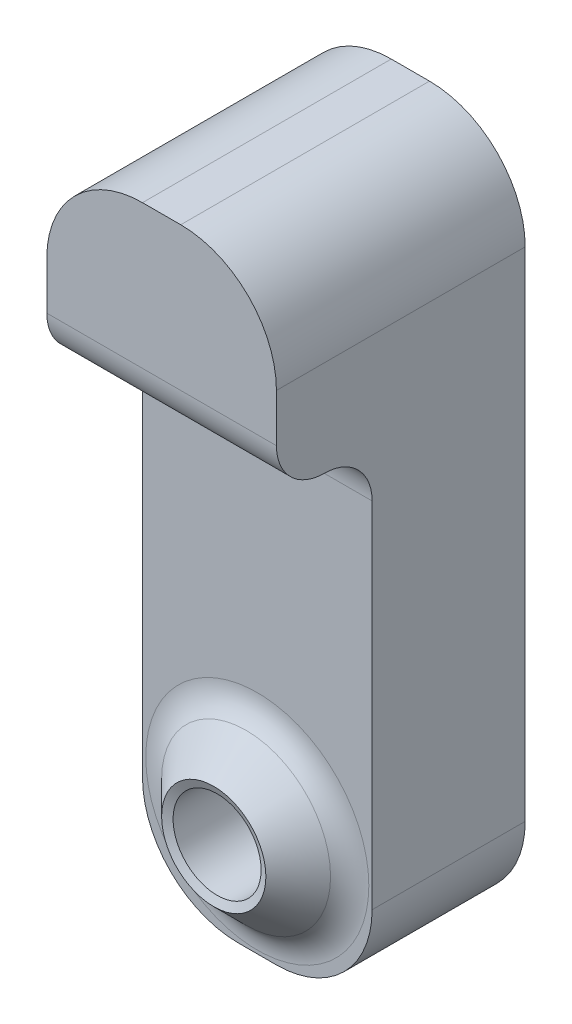
ISO-10303-21;
HEADER;
FILE_DESCRIPTION(('STEP AP214'),'2;1');
FILE_NAME('part.step','',(''),(''),'','','');
FILE_SCHEMA(('AUTOMOTIVE_DESIGN { 1 0 10303 214 1 1 1 1 }'));
ENDSEC;
DATA;
#1=APPLICATION_CONTEXT('core data for automotive mechanical design processes');
#2=APPLICATION_PROTOCOL_DEFINITION('international standard','automotive_design',2000,#1);
#3=PRODUCT_CONTEXT('',#1,'mechanical');
#4=PRODUCT('Part','Part','',(#3));
#5=PRODUCT_RELATED_PRODUCT_CATEGORY('part','',(#4));
#6=PRODUCT_DEFINITION_FORMATION('','',#4);
#7=PRODUCT_DEFINITION_CONTEXT('part definition',#1,'design');
#8=PRODUCT_DEFINITION('design','',#6,#7);
#9=PRODUCT_DEFINITION_SHAPE('','',#8);
#10=(LENGTH_UNIT() NAMED_UNIT(*) SI_UNIT(.MILLI.,.METRE.));
#11=(NAMED_UNIT(*) PLANE_ANGLE_UNIT() SI_UNIT($,.RADIAN.));
#12=(NAMED_UNIT(*) SI_UNIT($,.STERADIAN.) SOLID_ANGLE_UNIT());
#13=UNCERTAINTY_MEASURE_WITH_UNIT(LENGTH_MEASURE(1.E-05),#10,'distance_accuracy_value','');
#14=(GEOMETRIC_REPRESENTATION_CONTEXT(3) GLOBAL_UNCERTAINTY_ASSIGNED_CONTEXT((#13)) GLOBAL_UNIT_ASSIGNED_CONTEXT((#10,
#11,#12)) REPRESENTATION_CONTEXT('',''));
#15=CARTESIAN_POINT('',(0.,0.,0.));
#16=DIRECTION('',(0.,0.,1.));
#17=DIRECTION('',(1.,0.,0.));
#18=AXIS2_PLACEMENT_3D('',#15,#16,#17);
#19=CARTESIAN_POINT('',(0.,0.,8.));
#20=DIRECTION('',(0.,0.,1.));
#21=DIRECTION('',(1.,0.,0.));
#22=AXIS2_PLACEMENT_3D('',#19,#20,#21);
#23=PLANE('',#22);
#24=CARTESIAN_POINT('',(0.,-12.,8.));
#25=DIRECTION('',(0.,0.,1.));
#26=DIRECTION('',(1.,0.,0.));
#27=AXIS2_PLACEMENT_3D('',#24,#25,#26);
#28=CIRCLE('',#27,5.82842712474619);
#29=CARTESIAN_POINT('',(5.8284271247462,-12.,8.));
#30=VERTEX_POINT('',#29);
#31=EDGE_CURVE('E452',#30,#30,#28,.F.);
#32=ORIENTED_EDGE('',*,*,#31,.T.);
#33=EDGE_LOOP('',(#32));
#34=FACE_BOUND('',#33,.T.);
#35=DIRECTION('',(0.,1.,0.));
#36=VECTOR('',#35,1.);
#37=CARTESIAN_POINT('',(-6.,5.5,8.));
#38=LINE('',#37,#36);
#39=CARTESIAN_POINT('',(-6.,-13.,8.));
#40=VERTEX_POINT('',#39);
#41=CARTESIAN_POINT('',(-6.,5.5,8.));
#42=VERTEX_POINT('',#41);
#43=EDGE_CURVE('E138',#40,#42,#38,.T.);
#44=ORIENTED_EDGE('',*,*,#43,.F.);
#45=CARTESIAN_POINT('',(-1.,-13.,8.));
#46=DIRECTION('',(0.,0.,1.));
#47=DIRECTION('',(1.,0.,0.));
#48=AXIS2_PLACEMENT_3D('',#45,#46,#47);
#49=CIRCLE('',#48,5.);
#50=CARTESIAN_POINT('',(-1.,-18.,8.));
#51=VERTEX_POINT('',#50);
#52=EDGE_CURVE('E464',#40,#51,#49,.T.);
#53=ORIENTED_EDGE('',*,*,#52,.T.);
#54=DIRECTION('',(-1.,0.,0.));
#55=VECTOR('',#54,1.);
#56=CARTESIAN_POINT('',(-5.,-18.,8.));
#57=LINE('',#56,#55);
#58=CARTESIAN_POINT('',(0.999999999999998,-18.,8.));
#59=VERTEX_POINT('',#58);
#60=EDGE_CURVE('E175',#59,#51,#57,.T.);
#61=ORIENTED_EDGE('',*,*,#60,.F.);
#62=CARTESIAN_POINT('',(0.999999999999998,-13.,8.));
#63=DIRECTION('',(0.,0.,1.));
#64=DIRECTION('',(1.,0.,0.));
#65=AXIS2_PLACEMENT_3D('',#62,#63,#64);
#66=CIRCLE('',#65,5.);
#67=CARTESIAN_POINT('',(6.,-13.,8.));
#68=VERTEX_POINT('',#67);
#69=EDGE_CURVE('E462',#59,#68,#66,.T.);
#70=ORIENTED_EDGE('',*,*,#69,.T.);
#71=DIRECTION('',(0.,-1.,0.));
#72=VECTOR('',#71,1.);
#73=CARTESIAN_POINT('',(6.,-17.,8.));
#74=LINE('',#73,#72);
#75=CARTESIAN_POINT('',(6.,5.5,8.));
#76=VERTEX_POINT('',#75);
#77=EDGE_CURVE('E154',#76,#68,#74,.T.);
#78=ORIENTED_EDGE('',*,*,#77,.F.);
#79=DIRECTION('',(1.,0.,0.));
#80=VECTOR('',#79,1.);
#81=CARTESIAN_POINT('',(0.,5.5,8.));
#82=LINE('',#81,#80);
#83=EDGE_CURVE('E152',#76,#42,#82,.F.);
#84=ORIENTED_EDGE('',*,*,#83,.T.);
#85=EDGE_LOOP('',(#44,#53,#61,#70,#78,#84));
#86=FACE_BOUND('',#85,.T.);
#87=ADVANCED_FACE('F54',(#34,#86),#23,.T.);
#88=CARTESIAN_POINT('',(0.,0.,0.));
#89=DIRECTION('',(0.,0.,1.));
#90=DIRECTION('',(1.,0.,0.));
#91=AXIS2_PLACEMENT_3D('',#88,#89,#90);
#92=PLANE('',#91);
#93=CARTESIAN_POINT('',(0.,-12.,0.));
#94=DIRECTION('',(0.,0.,-1.));
#95=DIRECTION('',(1.,0.,0.));
#96=AXIS2_PLACEMENT_3D('',#93,#94,#95);
#97=CIRCLE('',#96,4.125);
#98=CARTESIAN_POINT('',(4.125,-12.,0.));
#99=VERTEX_POINT('',#98);
#100=EDGE_CURVE('E196',#99,#99,#97,.T.);
#101=ORIENTED_EDGE('',*,*,#100,.F.);
#102=EDGE_LOOP('',(#101));
#103=FACE_BOUND('',#102,.T.);
#104=DIRECTION('',(1.,0.,0.));
#105=VECTOR('',#104,1.);
#106=CARTESIAN_POINT('',(6.,-18.,0.));
#107=LINE('',#106,#105);
#108=CARTESIAN_POINT('',(-1.,-18.,0.));
#109=VERTEX_POINT('',#108);
#110=CARTESIAN_POINT('',(0.999999999999998,-18.,0.));
#111=VERTEX_POINT('',#110);
#112=EDGE_CURVE('E172',#109,#111,#107,.T.);
#113=ORIENTED_EDGE('',*,*,#112,.F.);
#114=CARTESIAN_POINT('',(-1.,-13.,0.));
#115=DIRECTION('',(0.,0.,1.));
#116=DIRECTION('',(1.,0.,0.));
#117=AXIS2_PLACEMENT_3D('',#114,#115,#116);
#118=CIRCLE('',#117,5.);
#119=CARTESIAN_POINT('',(-6.,-13.,0.));
#120=VERTEX_POINT('',#119);
#121=EDGE_CURVE('E477',#109,#120,#118,.F.);
#122=ORIENTED_EDGE('',*,*,#121,.T.);
#123=DIRECTION('',(0.,-1.,0.));
#124=VECTOR('',#123,1.);
#125=CARTESIAN_POINT('',(-6.,-18.,0.));
#126=LINE('',#125,#124);
#127=CARTESIAN_POINT('',(-6.,13.,0.));
#128=VERTEX_POINT('',#127);
#129=EDGE_CURVE('E149',#128,#120,#126,.T.);
#130=ORIENTED_EDGE('',*,*,#129,.F.);
#131=CARTESIAN_POINT('',(-1.,13.,0.));
#132=DIRECTION('',(0.,0.,1.));
#133=DIRECTION('',(1.,0.,0.));
#134=AXIS2_PLACEMENT_3D('',#131,#132,#133);
#135=CIRCLE('',#134,5.);
#136=CARTESIAN_POINT('',(-1.,18.,0.));
#137=VERTEX_POINT('',#136);
#138=EDGE_CURVE('E473',#128,#137,#135,.F.);
#139=ORIENTED_EDGE('',*,*,#138,.T.);
#140=DIRECTION('',(-1.,0.,0.));
#141=VECTOR('',#140,1.);
#142=CARTESIAN_POINT('',(-4.99999999999999,18.,0.));
#143=LINE('',#142,#141);
#144=CARTESIAN_POINT('',(1.,18.,0.));
#145=VERTEX_POINT('',#144);
#146=EDGE_CURVE('E180',#145,#137,#143,.T.);
#147=ORIENTED_EDGE('',*,*,#146,.F.);
#148=CARTESIAN_POINT('',(1.,13.,0.));
#149=DIRECTION('',(0.,0.,1.));
#150=DIRECTION('',(1.,0.,0.));
#151=AXIS2_PLACEMENT_3D('',#148,#149,#150);
#152=CIRCLE('',#151,5.);
#153=CARTESIAN_POINT('',(6.,13.,0.));
#154=VERTEX_POINT('',#153);
#155=EDGE_CURVE('E471',#145,#154,#152,.F.);
#156=ORIENTED_EDGE('',*,*,#155,.T.);
#157=DIRECTION('',(0.,1.,0.));
#158=VECTOR('',#157,1.);
#159=CARTESIAN_POINT('',(6.,10.5,0.));
#160=LINE('',#159,#158);
#161=CARTESIAN_POINT('',(6.,-13.,0.));
#162=VERTEX_POINT('',#161);
#163=EDGE_CURVE('E190',#162,#154,#160,.T.);
#164=ORIENTED_EDGE('',*,*,#163,.F.);
#165=CARTESIAN_POINT('',(0.999999999999998,-13.,0.));
#166=DIRECTION('',(0.,0.,1.));
#167=DIRECTION('',(1.,0.,0.));
#168=AXIS2_PLACEMENT_3D('',#165,#166,#167);
#169=CIRCLE('',#168,5.);
#170=EDGE_CURVE('E475',#162,#111,#169,.F.);
#171=ORIENTED_EDGE('',*,*,#170,.T.);
#172=EDGE_LOOP('',(#113,#122,#130,#139,#147,#156,#164,#171));
#173=FACE_BOUND('',#172,.T.);
#174=ADVANCED_FACE('F492',(#103,#173),#92,.F.);
#175=CARTESIAN_POINT('',(0.,10.5,10.5));
#176=DIRECTION('',(-1.,0.,0.));
#177=DIRECTION('',(0.,0.,1.));
#178=AXIS2_PLACEMENT_3D('',#175,#176,#177);
#179=CYLINDRICAL_SURFACE('',#178,2.5);
#180=DIRECTION('',(1.,0.,0.));
#181=VECTOR('',#180,1.);
#182=CARTESIAN_POINT('',(-6.,8.,10.5));
#183=LINE('',#182,#181);
#184=CARTESIAN_POINT('',(6.,8.,10.5));
#185=VERTEX_POINT('',#184);
#186=CARTESIAN_POINT('',(-6.,8.,10.5));
#187=VERTEX_POINT('',#186);
#188=EDGE_CURVE('E163',#185,#187,#183,.F.);
#189=ORIENTED_EDGE('',*,*,#188,.F.);
#190=CARTESIAN_POINT('',(6.,10.5,10.5));
#191=DIRECTION('',(1.,0.,0.));
#192=DIRECTION('',(0.,-1.,0.));
#193=AXIS2_PLACEMENT_3D('',#190,#191,#192);
#194=CIRCLE('',#193,2.5);
#195=CARTESIAN_POINT('',(6.,10.5,13.));
#196=VERTEX_POINT('',#195);
#197=EDGE_CURVE('E184',#196,#185,#194,.T.);
#198=ORIENTED_EDGE('',*,*,#197,.F.);
#199=DIRECTION('',(1.,0.,0.));
#200=VECTOR('',#199,1.);
#201=CARTESIAN_POINT('',(6.,10.5,13.));
#202=LINE('',#201,#200);
#203=CARTESIAN_POINT('',(-6.,10.5,13.));
#204=VERTEX_POINT('',#203);
#205=EDGE_CURVE('E160',#204,#196,#202,.T.);
#206=ORIENTED_EDGE('',*,*,#205,.F.);
#207=CARTESIAN_POINT('',(-6.,10.5,10.5));
#208=DIRECTION('',(-1.,0.,0.));
#209=DIRECTION('',(0.,1.,0.));
#210=AXIS2_PLACEMENT_3D('',#207,#208,#209);
#211=CIRCLE('',#210,2.5);
#212=EDGE_CURVE('E164',#187,#204,#211,.T.);
#213=ORIENTED_EDGE('',*,*,#212,.F.);
#214=EDGE_LOOP('',(#189,#198,#206,#213));
#215=FACE_BOUND('',#214,.T.);
#216=ADVANCED_FACE('F503',(#215),#179,.T.);
#217=CARTESIAN_POINT('',(0.,5.5,10.5));
#218=DIRECTION('',(1.,0.,0.));
#219=DIRECTION('',(0.,0.,-1.));
#220=AXIS2_PLACEMENT_3D('',#217,#218,#219);
#221=CYLINDRICAL_SURFACE('',#220,2.5);
#222=ORIENTED_EDGE('',*,*,#83,.F.);
#223=CARTESIAN_POINT('',(6.,5.5,10.5));
#224=DIRECTION('',(-1.,0.,0.));
#225=DIRECTION('',(0.,1.,0.));
#226=AXIS2_PLACEMENT_3D('',#223,#224,#225);
#227=CIRCLE('',#226,2.5);
#228=EDGE_CURVE('E187',#185,#76,#227,.T.);
#229=ORIENTED_EDGE('',*,*,#228,.F.);
#230=ORIENTED_EDGE('',*,*,#188,.T.);
#231=CARTESIAN_POINT('',(-6.,5.5,10.5));
#232=DIRECTION('',(1.,0.,0.));
#233=DIRECTION('',(0.,-1.,0.));
#234=AXIS2_PLACEMENT_3D('',#231,#232,#233);
#235=CIRCLE('',#234,2.5);
#236=EDGE_CURVE('E144',#42,#187,#235,.T.);
#237=ORIENTED_EDGE('',*,*,#236,.F.);
#238=EDGE_LOOP('',(#222,#229,#230,#237));
#239=FACE_BOUND('',#238,.T.);
#240=ADVANCED_FACE('F162',(#239),#221,.F.);
#241=CARTESIAN_POINT('',(0.,-12.,39.4724285712124));
#242=DIRECTION('',(0.,0.,-1.));
#243=DIRECTION('',(-1.,0.,0.));
#244=AXIS2_PLACEMENT_3D('',#241,#242,#243);
#245=CYLINDRICAL_SURFACE('',#244,2.3);
#246=CARTESIAN_POINT('',(0.,-12.,10.1));
#247=DIRECTION('',(0.,0.,1.));
#248=DIRECTION('',(1.,0.,0.));
#249=AXIS2_PLACEMENT_3D('',#246,#247,#248);
#250=CIRCLE('',#249,2.3);
#251=CARTESIAN_POINT('',(2.3,-12.,10.1));
#252=VERTEX_POINT('',#251);
#253=EDGE_CURVE('E449',#252,#252,#250,.T.);
#254=ORIENTED_EDGE('',*,*,#253,.T.);
#255=EDGE_LOOP('',(#254));
#256=FACE_BOUND('',#255,.T.);
#257=CARTESIAN_POINT('',(0.,-12.,4.));
#258=DIRECTION('',(0.,0.,-1.));
#259=DIRECTION('',(1.,0.,0.));
#260=AXIS2_PLACEMENT_3D('',#257,#258,#259);
#261=CIRCLE('',#260,2.3);
#262=CARTESIAN_POINT('',(2.3,-12.,4.));
#263=VERTEX_POINT('',#262);
#264=EDGE_CURVE('E193',#263,#263,#261,.T.);
#265=ORIENTED_EDGE('',*,*,#264,.T.);
#266=EDGE_LOOP('',(#265));
#267=FACE_BOUND('',#266,.T.);
#268=ADVANCED_FACE('F574',(#256,#267),#245,.F.);
#269=CARTESIAN_POINT('',(0.,-12.,12.));
#270=DIRECTION('',(0.,0.,-1.));
#271=DIRECTION('',(-1.,0.,0.));
#272=AXIS2_PLACEMENT_3D('',#269,#270,#271);
#273=CONICAL_SURFACE('',#272,1.,0.785398163397448);
#274=CARTESIAN_POINT('',(0.,-12.,8.5857864376269));
#275=DIRECTION('',(0.,0.,-1.));
#276=DIRECTION('',(-1.,0.,0.));
#277=AXIS2_PLACEMENT_3D('',#274,#275,#276);
#278=CIRCLE('',#277,4.4142135623731);
#279=CARTESIAN_POINT('',(-4.41421356237309,-12.,8.5857864376269));
#280=VERTEX_POINT('',#279);
#281=EDGE_CURVE('E455',#280,#280,#278,.F.);
#282=ORIENTED_EDGE('',*,*,#281,.T.);
#283=EDGE_LOOP('',(#282));
#284=FACE_BOUND('',#283,.T.);
#285=CARTESIAN_POINT('',(0.,-12.,10.2757359312881));
#286=DIRECTION('',(0.,0.,1.));
#287=DIRECTION('',(1.,0.,0.));
#288=AXIS2_PLACEMENT_3D('',#285,#286,#287);
#289=CIRCLE('',#288,2.72426406871192);
#290=CARTESIAN_POINT('',(2.72426406871192,-12.,10.2757359312881));
#291=VERTEX_POINT('',#290);
#292=EDGE_CURVE('E159',#291,#291,#289,.F.);
#293=ORIENTED_EDGE('',*,*,#292,.T.);
#294=EDGE_LOOP('',(#293));
#295=FACE_BOUND('',#294,.T.);
#296=ADVANCED_FACE('F570',(#284,#295),#273,.T.);
#297=CARTESIAN_POINT('',(0.,-12.,4.));
#298=DIRECTION('',(0.,0.,-1.));
#299=DIRECTION('',(-1.,0.,0.));
#300=AXIS2_PLACEMENT_3D('',#297,#298,#299);
#301=CYLINDRICAL_SURFACE('',#300,4.125);
#302=CARTESIAN_POINT('',(0.,-12.,4.));
#303=DIRECTION('',(0.,0.,-1.));
#304=DIRECTION('',(1.,0.,0.));
#305=AXIS2_PLACEMENT_3D('',#302,#303,#304);
#306=CIRCLE('',#305,4.125);
#307=CARTESIAN_POINT('',(4.125,-12.,4.));
#308=VERTEX_POINT('',#307);
#309=EDGE_CURVE('E197',#308,#308,#306,.T.);
#310=ORIENTED_EDGE('',*,*,#309,.F.);
#311=EDGE_LOOP('',(#310));
#312=FACE_BOUND('',#311,.T.);
#313=ORIENTED_EDGE('',*,*,#100,.T.);
#314=EDGE_LOOP('',(#313));
#315=FACE_BOUND('',#314,.T.);
#316=ADVANCED_FACE('F566',(#312,#315),#301,.F.);
#317=CARTESIAN_POINT('',(0.,-12.,4.));
#318=DIRECTION('',(0.,0.,1.));
#319=DIRECTION('',(1.,0.,0.));
#320=AXIS2_PLACEMENT_3D('',#317,#318,#319);
#321=PLANE('',#320);
#322=ORIENTED_EDGE('',*,*,#264,.F.);
#323=EDGE_LOOP('',(#322));
#324=FACE_BOUND('',#323,.T.);
#325=ORIENTED_EDGE('',*,*,#309,.T.);
#326=EDGE_LOOP('',(#325));
#327=FACE_BOUND('',#326,.T.);
#328=ADVANCED_FACE('F563',(#324,#327),#321,.F.);
#329=CARTESIAN_POINT('',(6.,5.5,10.5));
#330=DIRECTION('',(1.,0.,0.));
#331=DIRECTION('',(0.,1.,0.));
#332=AXIS2_PLACEMENT_3D('',#329,#330,#331);
#333=PLANE('',#332);
#334=ORIENTED_EDGE('',*,*,#77,.T.);
#335=DIRECTION('',(0.,0.,1.));
#336=VECTOR('',#335,1.);
#337=CARTESIAN_POINT('',(6.,-13.,0.));
#338=LINE('',#337,#336);
#339=EDGE_CURVE('E481',#68,#162,#338,.F.);
#340=ORIENTED_EDGE('',*,*,#339,.T.);
#341=ORIENTED_EDGE('',*,*,#163,.T.);
#342=DIRECTION('',(0.,0.,-1.));
#343=VECTOR('',#342,1.);
#344=CARTESIAN_POINT('',(6.,13.,13.));
#345=LINE('',#344,#343);
#346=CARTESIAN_POINT('',(6.,13.,13.));
#347=VERTEX_POINT('',#346);
#348=EDGE_CURVE('E479',#154,#347,#345,.F.);
#349=ORIENTED_EDGE('',*,*,#348,.T.);
#350=DIRECTION('',(0.,-1.,0.));
#351=VECTOR('',#350,1.);
#352=CARTESIAN_POINT('',(6.,18.,13.));
#353=LINE('',#352,#351);
#354=EDGE_CURVE('E182',#347,#196,#353,.T.);
#355=ORIENTED_EDGE('',*,*,#354,.T.);
#356=ORIENTED_EDGE('',*,*,#197,.T.);
#357=ORIENTED_EDGE('',*,*,#228,.T.);
#358=EDGE_LOOP('',(#334,#340,#341,#349,#355,#356,#357));
#359=FACE_BOUND('',#358,.T.);
#360=ADVANCED_FACE('F505',(#359),#333,.T.);
#361=CARTESIAN_POINT('',(6.,18.,13.));
#362=DIRECTION('',(0.,0.,-1.));
#363=DIRECTION('',(-1.,0.,0.));
#364=AXIS2_PLACEMENT_3D('',#361,#362,#363);
#365=PLANE('',#364);
#366=DIRECTION('',(1.,0.,0.));
#367=VECTOR('',#366,1.);
#368=CARTESIAN_POINT('',(6.,18.,13.));
#369=LINE('',#368,#367);
#370=CARTESIAN_POINT('',(-1.,18.,13.));
#371=VERTEX_POINT('',#370);
#372=CARTESIAN_POINT('',(1.,18.,13.));
#373=VERTEX_POINT('',#372);
#374=EDGE_CURVE('E178',#371,#373,#369,.T.);
#375=ORIENTED_EDGE('',*,*,#374,.F.);
#376=CARTESIAN_POINT('',(-1.,13.,13.));
#377=DIRECTION('',(0.,0.,-1.));
#378=DIRECTION('',(-1.,0.,0.));
#379=AXIS2_PLACEMENT_3D('',#376,#377,#378);
#380=CIRCLE('',#379,5.);
#381=CARTESIAN_POINT('',(-6.,13.,13.));
#382=VERTEX_POINT('',#381);
#383=EDGE_CURVE('E12',#371,#382,#380,.F.);
#384=ORIENTED_EDGE('',*,*,#383,.T.);
#385=DIRECTION('',(0.,1.,0.));
#386=VECTOR('',#385,1.);
#387=CARTESIAN_POINT('',(-6.,18.,13.));
#388=LINE('',#387,#386);
#389=EDGE_CURVE('E166',#204,#382,#388,.T.);
#390=ORIENTED_EDGE('',*,*,#389,.F.);
#391=ORIENTED_EDGE('',*,*,#205,.T.);
#392=ORIENTED_EDGE('',*,*,#354,.F.);
#393=CARTESIAN_POINT('',(1.,13.,13.));
#394=DIRECTION('',(0.,0.,-1.));
#395=DIRECTION('',(-1.,0.,0.));
#396=AXIS2_PLACEMENT_3D('',#393,#394,#395);
#397=CIRCLE('',#396,5.);
#398=EDGE_CURVE('E62',#347,#373,#397,.F.);
#399=ORIENTED_EDGE('',*,*,#398,.T.);
#400=EDGE_LOOP('',(#375,#384,#390,#391,#392,#399));
#401=FACE_BOUND('',#400,.T.);
#402=ADVANCED_FACE('F500',(#401),#365,.F.);
#403=CARTESIAN_POINT('',(0.,18.,0.));
#404=DIRECTION('',(0.,-1.,0.));
#405=DIRECTION('',(0.,0.,-1.));
#406=AXIS2_PLACEMENT_3D('',#403,#404,#405);
#407=PLANE('',#406);
#408=ORIENTED_EDGE('',*,*,#146,.T.);
#409=DIRECTION('',(0.,0.,-1.));
#410=VECTOR('',#409,1.);
#411=CARTESIAN_POINT('',(-1.,18.,0.));
#412=LINE('',#411,#410);
#413=EDGE_CURVE('E75',#137,#371,#412,.F.);
#414=ORIENTED_EDGE('',*,*,#413,.T.);
#415=ORIENTED_EDGE('',*,*,#374,.T.);
#416=DIRECTION('',(0.,0.,-1.));
#417=VECTOR('',#416,1.);
#418=CARTESIAN_POINT('',(1.,18.,0.));
#419=LINE('',#418,#417);
#420=EDGE_CURVE('E483',#373,#145,#419,.T.);
#421=ORIENTED_EDGE('',*,*,#420,.T.);
#422=EDGE_LOOP('',(#408,#414,#415,#421));
#423=FACE_BOUND('',#422,.T.);
#424=ADVANCED_FACE('F488',(#423),#407,.F.);
#425=CARTESIAN_POINT('',(0.,-18.,0.));
#426=DIRECTION('',(0.,1.,0.));
#427=DIRECTION('',(0.,0.,1.));
#428=AXIS2_PLACEMENT_3D('',#425,#426,#427);
#429=PLANE('',#428);
#430=ORIENTED_EDGE('',*,*,#60,.T.);
#431=DIRECTION('',(0.,0.,1.));
#432=VECTOR('',#431,1.);
#433=CARTESIAN_POINT('',(-1.,-18.,0.));
#434=LINE('',#433,#432);
#435=EDGE_CURVE('E469',#51,#109,#434,.F.);
#436=ORIENTED_EDGE('',*,*,#435,.T.);
#437=ORIENTED_EDGE('',*,*,#112,.T.);
#438=DIRECTION('',(0.,0.,1.));
#439=VECTOR('',#438,1.);
#440=CARTESIAN_POINT('',(0.999999999999998,-18.,8.));
#441=LINE('',#440,#439);
#442=EDGE_CURVE('E466',#111,#59,#441,.T.);
#443=ORIENTED_EDGE('',*,*,#442,.T.);
#444=EDGE_LOOP('',(#430,#436,#437,#443));
#445=FACE_BOUND('',#444,.T.);
#446=ADVANCED_FACE('F547',(#445),#429,.F.);
#447=CARTESIAN_POINT('',(-6.,10.5,10.5));
#448=DIRECTION('',(1.,0.,0.));
#449=DIRECTION('',(0.,1.,0.));
#450=AXIS2_PLACEMENT_3D('',#447,#448,#449);
#451=PLANE('',#450);
#452=ORIENTED_EDGE('',*,*,#129,.T.);
#453=DIRECTION('',(0.,0.,1.));
#454=VECTOR('',#453,1.);
#455=CARTESIAN_POINT('',(-6.,-13.,10.5));
#456=LINE('',#455,#454);
#457=EDGE_CURVE('E147',#120,#40,#456,.T.);
#458=ORIENTED_EDGE('',*,*,#457,.T.);
#459=ORIENTED_EDGE('',*,*,#43,.T.);
#460=ORIENTED_EDGE('',*,*,#236,.T.);
#461=ORIENTED_EDGE('',*,*,#212,.T.);
#462=ORIENTED_EDGE('',*,*,#389,.T.);
#463=DIRECTION('',(0.,0.,-1.));
#464=VECTOR('',#463,1.);
#465=CARTESIAN_POINT('',(-6.,13.,10.5));
#466=LINE('',#465,#464);
#467=EDGE_CURVE('E458',#382,#128,#466,.T.);
#468=ORIENTED_EDGE('',*,*,#467,.T.);
#469=EDGE_LOOP('',(#452,#458,#459,#460,#461,#462,#468));
#470=FACE_BOUND('',#469,.T.);
#471=ADVANCED_FACE('F141',(#470),#451,.F.);
#472=CARTESIAN_POINT('',(0.,-12.,10.2757359312881));
#473=DIRECTION('',(0.,0.,1.));
#474=DIRECTION('',(1.,0.,0.));
#475=AXIS2_PLACEMENT_3D('',#472,#473,#474);
#476=CONICAL_SURFACE('',#475,2.72426406871192,1.17809724509618);
#477=ORIENTED_EDGE('',*,*,#253,.F.);
#478=EDGE_LOOP('',(#477));
#479=FACE_BOUND('',#478,.T.);
#480=ORIENTED_EDGE('',*,*,#292,.F.);
#481=EDGE_LOOP('',(#480));
#482=FACE_BOUND('',#481,.T.);
#483=ADVANCED_FACE('F524',(#479,#482),#476,.F.);
#484=CARTESIAN_POINT('',(0.,-12.,10.));
#485=DIRECTION('',(0.,0.,1.));
#486=DIRECTION('',(1.,0.,0.));
#487=AXIS2_PLACEMENT_3D('',#484,#485,#486);
#488=TOROIDAL_SURFACE('',#487,5.82842712474619,2.);
#489=ORIENTED_EDGE('',*,*,#281,.F.);
#490=EDGE_LOOP('',(#489));
#491=FACE_BOUND('',#490,.T.);
#492=ORIENTED_EDGE('',*,*,#31,.F.);
#493=EDGE_LOOP('',(#492));
#494=FACE_BOUND('',#493,.T.);
#495=ADVANCED_FACE('F529',(#491,#494),#488,.F.);
#496=CARTESIAN_POINT('',(-1.,-13.,10.5));
#497=DIRECTION('',(0.,0.,1.));
#498=DIRECTION('',(1.,0.,0.));
#499=AXIS2_PLACEMENT_3D('',#496,#497,#498);
#500=CYLINDRICAL_SURFACE('',#499,5.);
#501=ORIENTED_EDGE('',*,*,#121,.F.);
#502=ORIENTED_EDGE('',*,*,#435,.F.);
#503=ORIENTED_EDGE('',*,*,#52,.F.);
#504=ORIENTED_EDGE('',*,*,#457,.F.);
#505=EDGE_LOOP('',(#501,#502,#503,#504));
#506=FACE_BOUND('',#505,.T.);
#507=ADVANCED_FACE('F533',(#506),#500,.T.);
#508=CARTESIAN_POINT('',(0.999999999999998,-13.,0.));
#509=DIRECTION('',(0.,0.,-1.));
#510=DIRECTION('',(-1.,0.,0.));
#511=AXIS2_PLACEMENT_3D('',#508,#509,#510);
#512=CYLINDRICAL_SURFACE('',#511,5.);
#513=ORIENTED_EDGE('',*,*,#170,.F.);
#514=ORIENTED_EDGE('',*,*,#339,.F.);
#515=ORIENTED_EDGE('',*,*,#69,.F.);
#516=ORIENTED_EDGE('',*,*,#442,.F.);
#517=EDGE_LOOP('',(#513,#514,#515,#516));
#518=FACE_BOUND('',#517,.T.);
#519=ADVANCED_FACE('F511',(#518),#512,.T.);
#520=CARTESIAN_POINT('',(-1.,13.,10.5));
#521=DIRECTION('',(0.,0.,-1.));
#522=DIRECTION('',(-1.,0.,0.));
#523=AXIS2_PLACEMENT_3D('',#520,#521,#522);
#524=CYLINDRICAL_SURFACE('',#523,5.);
#525=ORIENTED_EDGE('',*,*,#383,.F.);
#526=ORIENTED_EDGE('',*,*,#413,.F.);
#527=ORIENTED_EDGE('',*,*,#138,.F.);
#528=ORIENTED_EDGE('',*,*,#467,.F.);
#529=EDGE_LOOP('',(#525,#526,#527,#528));
#530=FACE_BOUND('',#529,.T.);
#531=ADVANCED_FACE('F498',(#530),#524,.T.);
#532=CARTESIAN_POINT('',(1.,13.,0.));
#533=DIRECTION('',(0.,0.,1.));
#534=DIRECTION('',(1.,0.,0.));
#535=AXIS2_PLACEMENT_3D('',#532,#533,#534);
#536=CYLINDRICAL_SURFACE('',#535,5.);
#537=ORIENTED_EDGE('',*,*,#398,.F.);
#538=ORIENTED_EDGE('',*,*,#348,.F.);
#539=ORIENTED_EDGE('',*,*,#155,.F.);
#540=ORIENTED_EDGE('',*,*,#420,.F.);
#541=EDGE_LOOP('',(#537,#538,#539,#540));
#542=FACE_BOUND('',#541,.T.);
#543=ADVANCED_FACE('F56',(#542),#536,.T.);
#544=CLOSED_SHELL('',(#87,#174,#216,#240,#268,#296,#316,#328,#360,#402,#424,#446,#471,#483,#495,
#507,#519,#531,#543));
#545=MANIFOLD_SOLID_BREP('B2',#544);
#546=ADVANCED_BREP_SHAPE_REPRESENTATION('',(#18,#545),#14);
#547=SHAPE_DEFINITION_REPRESENTATION(#9,#546);
ENDSEC;
END-ISO-10303-21;
